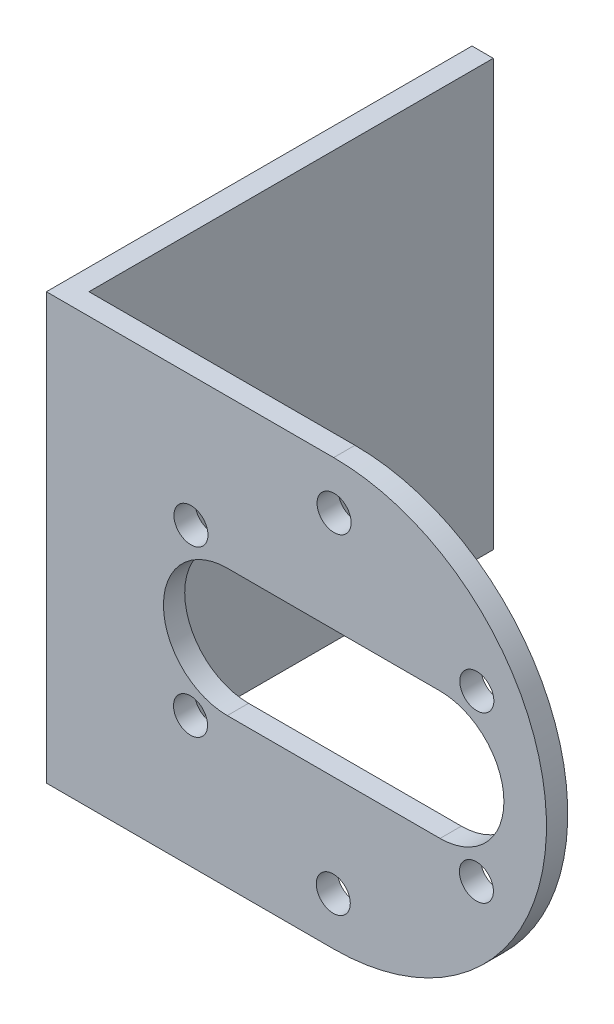
ISO-10303-21;
HEADER;
FILE_DESCRIPTION(('STEP AP214'),'2;1');
FILE_NAME('part.step','',(''),(''),'','','');
FILE_SCHEMA(('AUTOMOTIVE_DESIGN { 1 0 10303 214 1 1 1 1 }'));
ENDSEC;
DATA;
#1=APPLICATION_CONTEXT('core data for automotive mechanical design processes');
#2=APPLICATION_PROTOCOL_DEFINITION('international standard','automotive_design',2000,#1);
#3=PRODUCT_CONTEXT('',#1,'mechanical');
#4=PRODUCT('Part','Part','',(#3));
#5=PRODUCT_RELATED_PRODUCT_CATEGORY('part','',(#4));
#6=PRODUCT_DEFINITION_FORMATION('','',#4);
#7=PRODUCT_DEFINITION_CONTEXT('part definition',#1,'design');
#8=PRODUCT_DEFINITION('design','',#6,#7);
#9=PRODUCT_DEFINITION_SHAPE('','',#8);
#10=(LENGTH_UNIT() NAMED_UNIT(*) SI_UNIT(.MILLI.,.METRE.));
#11=(NAMED_UNIT(*) PLANE_ANGLE_UNIT() SI_UNIT($,.RADIAN.));
#12=(NAMED_UNIT(*) SI_UNIT($,.STERADIAN.) SOLID_ANGLE_UNIT());
#13=UNCERTAINTY_MEASURE_WITH_UNIT(LENGTH_MEASURE(1.E-05),#10,'distance_accuracy_value','');
#14=(GEOMETRIC_REPRESENTATION_CONTEXT(3) GLOBAL_UNCERTAINTY_ASSIGNED_CONTEXT((#13)) GLOBAL_UNIT_ASSIGNED_CONTEXT((#10,
#11,#12)) REPRESENTATION_CONTEXT('',''));
#15=CARTESIAN_POINT('',(0.,0.,0.));
#16=DIRECTION('',(0.,0.,1.));
#17=DIRECTION('',(1.,0.,0.));
#18=AXIS2_PLACEMENT_3D('',#15,#16,#17);
#19=CARTESIAN_POINT('',(2.,0.,0.));
#20=DIRECTION('',(-1.,0.,0.));
#21=DIRECTION('',(0.,0.,1.));
#22=AXIS2_PLACEMENT_3D('',#19,#20,#21);
#23=PLANE('',#22);
#24=DIRECTION('',(0.,1.,0.));
#25=VECTOR('',#24,1.);
#26=CARTESIAN_POINT('',(2.,0.,18.0000000000001));
#27=LINE('',#26,#25);
#28=CARTESIAN_POINT('',(2.,-20.,18.0000000000001));
#29=VERTEX_POINT('',#28);
#30=CARTESIAN_POINT('',(2.,20.,18.0000000000001));
#31=VERTEX_POINT('',#30);
#32=EDGE_CURVE('E225',#29,#31,#27,.T.);
#33=ORIENTED_EDGE('',*,*,#32,.F.);
#34=DIRECTION('',(0.,0.,-1.));
#35=VECTOR('',#34,1.);
#36=CARTESIAN_POINT('',(2.,-20.,-20.));
#37=LINE('',#36,#35);
#38=CARTESIAN_POINT('',(2.,-20.,-20.));
#39=VERTEX_POINT('',#38);
#40=EDGE_CURVE('E231',#29,#39,#37,.T.);
#41=ORIENTED_EDGE('',*,*,#40,.T.);
#42=DIRECTION('',(0.,1.,0.));
#43=VECTOR('',#42,1.);
#44=CARTESIAN_POINT('',(2.,20.,-19.9999999999999));
#45=LINE('',#44,#43);
#46=CARTESIAN_POINT('',(2.,20.,-19.9999999999999));
#47=VERTEX_POINT('',#46);
#48=EDGE_CURVE('E233',#39,#47,#45,.T.);
#49=ORIENTED_EDGE('',*,*,#48,.T.);
#50=DIRECTION('',(0.,0.,1.));
#51=VECTOR('',#50,1.);
#52=CARTESIAN_POINT('',(2.,20.,-19.9999999999999));
#53=LINE('',#52,#51);
#54=EDGE_CURVE('E236',#47,#31,#53,.T.);
#55=ORIENTED_EDGE('',*,*,#54,.T.);
#56=EDGE_LOOP('',(#33,#41,#49,#55));
#57=FACE_BOUND('',#56,.T.);
#58=ADVANCED_FACE('F43',(#57),#23,.F.);
#59=CARTESIAN_POINT('',(2.,20.,20.0000000000001));
#60=DIRECTION('',(0.,0.,-1.));
#61=DIRECTION('',(-1.,0.,0.));
#62=AXIS2_PLACEMENT_3D('',#59,#60,#61);
#63=PLANE('',#62);
#64=DIRECTION('',(-1.,0.,0.));
#65=VECTOR('',#64,1.);
#66=CARTESIAN_POINT('',(37.,5.99999999999994,20.0000000000001));
#67=LINE('',#66,#65);
#68=CARTESIAN_POINT('',(37.,5.99999999999994,20.0000000000001));
#69=VERTEX_POINT('',#68);
#70=CARTESIAN_POINT('',(17.,5.99999999999994,20.0000000000001));
#71=VERTEX_POINT('',#70);
#72=EDGE_CURVE('E132',#69,#71,#67,.T.);
#73=ORIENTED_EDGE('',*,*,#72,.F.);
#74=CARTESIAN_POINT('',(37.,0.,20.0000000000001));
#75=DIRECTION('',(0.,0.,1.));
#76=DIRECTION('',(1.,0.,0.));
#77=AXIS2_PLACEMENT_3D('',#74,#75,#76);
#78=CIRCLE('',#77,6.);
#79=CARTESIAN_POINT('',(37.,-6.00000000000006,20.0000000000001));
#80=VERTEX_POINT('',#79);
#81=EDGE_CURVE('E58',#80,#69,#78,.T.);
#82=ORIENTED_EDGE('',*,*,#81,.F.);
#83=DIRECTION('',(-1.,0.,0.));
#84=VECTOR('',#83,1.);
#85=CARTESIAN_POINT('',(37.,-6.00000000000006,20.0000000000001));
#86=LINE('',#85,#84);
#87=CARTESIAN_POINT('',(17.,-6.00000000000006,20.0000000000001));
#88=VERTEX_POINT('',#87);
#89=EDGE_CURVE('E138',#80,#88,#86,.T.);
#90=ORIENTED_EDGE('',*,*,#89,.T.);
#91=CARTESIAN_POINT('',(17.,0.,20.0000000000001));
#92=DIRECTION('',(0.,0.,1.));
#93=DIRECTION('',(1.,0.,0.));
#94=AXIS2_PLACEMENT_3D('',#91,#92,#93);
#95=CIRCLE('',#94,6.);
#96=EDGE_CURVE('E123',#71,#88,#95,.T.);
#97=ORIENTED_EDGE('',*,*,#96,.F.);
#98=EDGE_LOOP('',(#73,#82,#90,#97));
#99=FACE_BOUND('',#98,.T.);
#100=CARTESIAN_POINT('',(40.4536391388718,7.72278329006898,20.0000000000001));
#101=DIRECTION('',(0.,0.,1.));
#102=DIRECTION('',(-0.965925826289071,0.25881904510251,0.));
#103=AXIS2_PLACEMENT_3D('',#100,#101,#102);
#104=ELLIPSE('',#103,1.6,1.6);
#105=CARTESIAN_POINT('',(38.9081578168092,8.136893762233,20.0000000000001));
#106=VERTEX_POINT('',#105);
#107=EDGE_CURVE('E145',#106,#106,#104,.T.);
#108=ORIENTED_EDGE('',*,*,#107,.F.);
#109=EDGE_LOOP('',(#108));
#110=FACE_BOUND('',#109,.T.);
#111=CARTESIAN_POINT('',(40.4149460865576,-7.78980162257708,20.0000000000001));
#112=DIRECTION('',(0.,0.,1.));
#113=DIRECTION('',(-0.258819045102529,0.965925826289066,0.));
#114=AXIS2_PLACEMENT_3D('',#111,#112,#113);
#115=ELLIPSE('',#114,1.6,1.6);
#116=CARTESIAN_POINT('',(40.0008356143935,-6.24432030051457,20.0000000000001));
#117=VERTEX_POINT('',#116);
#118=EDGE_CURVE('E181',#117,#117,#115,.T.);
#119=ORIENTED_EDGE('',*,*,#118,.F.);
#120=EDGE_LOOP('',(#119));
#121=FACE_BOUND('',#120,.T.);
#122=CARTESIAN_POINT('',(26.9613069476856,-15.512584912646,20.0000000000001));
#123=DIRECTION('',(0.,0.,1.));
#124=DIRECTION('',(0.707106781186548,0.707106781186547,0.));
#125=AXIS2_PLACEMENT_3D('',#122,#123,#124);
#126=ELLIPSE('',#125,1.6,1.6);
#127=CARTESIAN_POINT('',(28.0926777975841,-14.3812140627475,20.0000000000001));
#128=VERTEX_POINT('',#127);
#129=EDGE_CURVE('E175',#128,#128,#126,.T.);
#130=ORIENTED_EDGE('',*,*,#129,.F.);
#131=EDGE_LOOP('',(#130));
#132=FACE_BOUND('',#131,.T.);
#133=CARTESIAN_POINT('',(13.5463608611282,-7.72278329006889,20.0000000000001));
#134=DIRECTION('',(0.,0.,1.));
#135=DIRECTION('',(0.96592582628907,-0.258819045102517,0.));
#136=AXIS2_PLACEMENT_3D('',#133,#134,#135);
#137=ELLIPSE('',#136,1.6,1.6);
#138=CARTESIAN_POINT('',(15.0918421831907,-8.13689376223292,20.0000000000001));
#139=VERTEX_POINT('',#138);
#140=EDGE_CURVE('E153',#139,#139,#137,.T.);
#141=ORIENTED_EDGE('',*,*,#140,.F.);
#142=EDGE_LOOP('',(#141));
#143=FACE_BOUND('',#142,.T.);
#144=CARTESIAN_POINT('',(13.5850539134425,7.78980162257717,20.0000000000001));
#145=DIRECTION('',(0.,0.,1.));
#146=DIRECTION('',(0.258819045102522,-0.965925826289068,0.));
#147=AXIS2_PLACEMENT_3D('',#144,#145,#146);
#148=ELLIPSE('',#147,1.6,1.6);
#149=CARTESIAN_POINT('',(13.9991643856065,6.24432030051466,20.0000000000001));
#150=VERTEX_POINT('',#149);
#151=EDGE_CURVE('E152',#150,#150,#148,.T.);
#152=ORIENTED_EDGE('',*,*,#151,.F.);
#153=EDGE_LOOP('',(#152));
#154=FACE_BOUND('',#153,.T.);
#155=CARTESIAN_POINT('',(27.0386930523144,15.512584912646,20.0000000000001));
#156=DIRECTION('',(0.,0.,1.));
#157=DIRECTION('',(-0.707106781186548,-0.707106781186547,0.));
#158=AXIS2_PLACEMENT_3D('',#155,#156,#157);
#159=ELLIPSE('',#158,1.6,1.6);
#160=CARTESIAN_POINT('',(25.9073222024159,14.3812140627475,20.0000000000001));
#161=VERTEX_POINT('',#160);
#162=EDGE_CURVE('E203',#161,#161,#159,.T.);
#163=ORIENTED_EDGE('',*,*,#162,.F.);
#164=EDGE_LOOP('',(#163));
#165=FACE_BOUND('',#164,.T.);
#166=DIRECTION('',(0.,-1.,0.));
#167=VECTOR('',#166,1.);
#168=CARTESIAN_POINT('',(0.,20.,20.0000000000001));
#169=LINE('',#168,#167);
#170=CARTESIAN_POINT('',(0.,20.,20.0000000000001));
#171=VERTEX_POINT('',#170);
#172=CARTESIAN_POINT('',(0.,-20.,20.0000000000001));
#173=VERTEX_POINT('',#172);
#174=EDGE_CURVE('E230',#171,#173,#169,.T.);
#175=ORIENTED_EDGE('',*,*,#174,.T.);
#176=DIRECTION('',(-1.,0.,0.));
#177=VECTOR('',#176,1.);
#178=CARTESIAN_POINT('',(2.,-20.,20.0000000000001));
#179=LINE('',#178,#177);
#180=CARTESIAN_POINT('',(27.,-20.,20.0000000000001));
#181=VERTEX_POINT('',#180);
#182=EDGE_CURVE('E254',#181,#173,#179,.T.);
#183=ORIENTED_EDGE('',*,*,#182,.F.);
#184=CARTESIAN_POINT('',(27.,0.,20.0000000000001));
#185=DIRECTION('',(0.,0.,1.));
#186=DIRECTION('',(1.,0.,0.));
#187=AXIS2_PLACEMENT_3D('',#184,#185,#186);
#188=CIRCLE('',#187,20.);
#189=CARTESIAN_POINT('',(27.,20.,20.0000000000001));
#190=VERTEX_POINT('',#189);
#191=EDGE_CURVE('E209',#181,#190,#188,.T.);
#192=ORIENTED_EDGE('',*,*,#191,.T.);
#193=DIRECTION('',(-1.,0.,0.));
#194=VECTOR('',#193,1.);
#195=CARTESIAN_POINT('',(2.,20.,20.0000000000001));
#196=LINE('',#195,#194);
#197=EDGE_CURVE('E238',#190,#171,#196,.T.);
#198=ORIENTED_EDGE('',*,*,#197,.T.);
#199=EDGE_LOOP('',(#175,#183,#192,#198));
#200=FACE_BOUND('',#199,.T.);
#201=ADVANCED_FACE('F45',(#99,#110,#121,#132,#143,#154,#165,#200),#63,.F.);
#202=CARTESIAN_POINT('',(2.,-20.,-20.));
#203=DIRECTION('',(0.,1.,0.));
#204=DIRECTION('',(0.,0.,1.));
#205=AXIS2_PLACEMENT_3D('',#202,#203,#204);
#206=PLANE('',#205);
#207=DIRECTION('',(0.,0.,-1.));
#208=VECTOR('',#207,1.);
#209=CARTESIAN_POINT('',(0.,-20.,-20.));
#210=LINE('',#209,#208);
#211=CARTESIAN_POINT('',(0.,-20.,-20.));
#212=VERTEX_POINT('',#211);
#213=EDGE_CURVE('E241',#173,#212,#210,.T.);
#214=ORIENTED_EDGE('',*,*,#213,.T.);
#215=DIRECTION('',(-1.,0.,0.));
#216=VECTOR('',#215,1.);
#217=CARTESIAN_POINT('',(2.,-20.,-20.));
#218=LINE('',#217,#216);
#219=EDGE_CURVE('E251',#39,#212,#218,.T.);
#220=ORIENTED_EDGE('',*,*,#219,.F.);
#221=ORIENTED_EDGE('',*,*,#40,.F.);
#222=DIRECTION('',(1.,0.,0.));
#223=VECTOR('',#222,1.);
#224=CARTESIAN_POINT('',(0.,-20.,18.0000000000001));
#225=LINE('',#224,#223);
#226=CARTESIAN_POINT('',(27.,-20.,18.0000000000001));
#227=VERTEX_POINT('',#226);
#228=EDGE_CURVE('E212',#29,#227,#225,.T.);
#229=ORIENTED_EDGE('',*,*,#228,.T.);
#230=DIRECTION('',(0.,0.,1.));
#231=VECTOR('',#230,1.);
#232=CARTESIAN_POINT('',(27.,-20.,18.0000000000001));
#233=LINE('',#232,#231);
#234=EDGE_CURVE('E219',#227,#181,#233,.T.);
#235=ORIENTED_EDGE('',*,*,#234,.T.);
#236=ORIENTED_EDGE('',*,*,#182,.T.);
#237=EDGE_LOOP('',(#214,#220,#221,#229,#235,#236));
#238=FACE_BOUND('',#237,.T.);
#239=ADVANCED_FACE('F280',(#238),#206,.F.);
#240=CARTESIAN_POINT('',(2.,20.,-19.9999999999999));
#241=DIRECTION('',(0.,0.,1.));
#242=DIRECTION('',(0.,-1.,0.));
#243=AXIS2_PLACEMENT_3D('',#240,#241,#242);
#244=PLANE('',#243);
#245=DIRECTION('',(0.,1.,0.));
#246=VECTOR('',#245,1.);
#247=CARTESIAN_POINT('',(0.,20.,-19.9999999999999));
#248=LINE('',#247,#246);
#249=CARTESIAN_POINT('',(0.,20.,-19.9999999999999));
#250=VERTEX_POINT('',#249);
#251=EDGE_CURVE('E243',#212,#250,#248,.T.);
#252=ORIENTED_EDGE('',*,*,#251,.T.);
#253=DIRECTION('',(-1.,0.,0.));
#254=VECTOR('',#253,1.);
#255=CARTESIAN_POINT('',(2.,20.,-19.9999999999999));
#256=LINE('',#255,#254);
#257=EDGE_CURVE('E248',#47,#250,#256,.T.);
#258=ORIENTED_EDGE('',*,*,#257,.F.);
#259=ORIENTED_EDGE('',*,*,#48,.F.);
#260=ORIENTED_EDGE('',*,*,#219,.T.);
#261=EDGE_LOOP('',(#252,#258,#259,#260));
#262=FACE_BOUND('',#261,.T.);
#263=ADVANCED_FACE('F291',(#262),#244,.F.);
#264=CARTESIAN_POINT('',(2.,20.,-19.9999999999999));
#265=DIRECTION('',(0.,-1.,0.));
#266=DIRECTION('',(0.,0.,-1.));
#267=AXIS2_PLACEMENT_3D('',#264,#265,#266);
#268=PLANE('',#267);
#269=ORIENTED_EDGE('',*,*,#197,.F.);
#270=DIRECTION('',(0.,0.,1.));
#271=VECTOR('',#270,1.);
#272=CARTESIAN_POINT('',(27.,20.,18.0000000000001));
#273=LINE('',#272,#271);
#274=CARTESIAN_POINT('',(27.,20.,18.0000000000001));
#275=VERTEX_POINT('',#274);
#276=EDGE_CURVE('E222',#275,#190,#273,.T.);
#277=ORIENTED_EDGE('',*,*,#276,.F.);
#278=DIRECTION('',(1.,0.,0.));
#279=VECTOR('',#278,1.);
#280=CARTESIAN_POINT('',(0.,20.,18.0000000000001));
#281=LINE('',#280,#279);
#282=EDGE_CURVE('E217',#31,#275,#281,.T.);
#283=ORIENTED_EDGE('',*,*,#282,.F.);
#284=ORIENTED_EDGE('',*,*,#54,.F.);
#285=ORIENTED_EDGE('',*,*,#257,.T.);
#286=DIRECTION('',(0.,0.,1.));
#287=VECTOR('',#286,1.);
#288=CARTESIAN_POINT('',(0.,20.,-19.9999999999999));
#289=LINE('',#288,#287);
#290=EDGE_CURVE('E234',#250,#171,#289,.T.);
#291=ORIENTED_EDGE('',*,*,#290,.T.);
#292=EDGE_LOOP('',(#269,#277,#283,#284,#285,#291));
#293=FACE_BOUND('',#292,.T.);
#294=ADVANCED_FACE('F287',(#293),#268,.F.);
#295=CARTESIAN_POINT('',(0.,0.,0.));
#296=DIRECTION('',(-1.,0.,0.));
#297=DIRECTION('',(0.,0.,1.));
#298=AXIS2_PLACEMENT_3D('',#295,#296,#297);
#299=PLANE('',#298);
#300=ORIENTED_EDGE('',*,*,#174,.F.);
#301=ORIENTED_EDGE('',*,*,#290,.F.);
#302=ORIENTED_EDGE('',*,*,#251,.F.);
#303=ORIENTED_EDGE('',*,*,#213,.F.);
#304=EDGE_LOOP('',(#300,#301,#302,#303));
#305=FACE_BOUND('',#304,.T.);
#306=ADVANCED_FACE('F284',(#305),#299,.T.);
#307=CARTESIAN_POINT('',(27.,0.,18.0000000000001));
#308=DIRECTION('',(0.,0.,1.));
#309=DIRECTION('',(1.,0.,0.));
#310=AXIS2_PLACEMENT_3D('',#307,#308,#309);
#311=PLANE('',#310);
#312=DIRECTION('',(-1.,0.,0.));
#313=VECTOR('',#312,1.);
#314=CARTESIAN_POINT('',(27.,-6.00000000000006,18.0000000000001));
#315=LINE('',#314,#313);
#316=CARTESIAN_POINT('',(37.,-6.00000000000006,18.0000000000001));
#317=VERTEX_POINT('',#316);
#318=CARTESIAN_POINT('',(17.,-6.00000000000006,18.0000000000001));
#319=VERTEX_POINT('',#318);
#320=EDGE_CURVE('E51',#317,#319,#315,.T.);
#321=ORIENTED_EDGE('',*,*,#320,.F.);
#322=CARTESIAN_POINT('',(37.,0.,18.0000000000001));
#323=DIRECTION('',(0.,0.,1.));
#324=DIRECTION('',(1.,0.,0.));
#325=AXIS2_PLACEMENT_3D('',#322,#323,#324);
#326=CIRCLE('',#325,6.);
#327=CARTESIAN_POINT('',(37.,5.99999999999994,18.0000000000001));
#328=VERTEX_POINT('',#327);
#329=EDGE_CURVE('E11',#317,#328,#326,.T.);
#330=ORIENTED_EDGE('',*,*,#329,.T.);
#331=DIRECTION('',(-1.,0.,0.));
#332=VECTOR('',#331,1.);
#333=CARTESIAN_POINT('',(27.,5.99999999999994,18.0000000000001));
#334=LINE('',#333,#332);
#335=CARTESIAN_POINT('',(17.,5.99999999999994,18.0000000000001));
#336=VERTEX_POINT('',#335);
#337=EDGE_CURVE('E257',#328,#336,#334,.T.);
#338=ORIENTED_EDGE('',*,*,#337,.T.);
#339=CARTESIAN_POINT('',(17.,0.,18.0000000000001));
#340=DIRECTION('',(0.,0.,1.));
#341=DIRECTION('',(1.,0.,0.));
#342=AXIS2_PLACEMENT_3D('',#339,#340,#341);
#343=CIRCLE('',#342,6.);
#344=EDGE_CURVE('E126',#336,#319,#343,.T.);
#345=ORIENTED_EDGE('',*,*,#344,.T.);
#346=EDGE_LOOP('',(#321,#330,#338,#345));
#347=FACE_BOUND('',#346,.T.);
#348=CARTESIAN_POINT('',(40.4536391388718,7.72278329006898,18.0000000000001));
#349=DIRECTION('',(0.,0.,1.));
#350=DIRECTION('',(-0.965925826289071,0.25881904510251,0.));
#351=AXIS2_PLACEMENT_3D('',#348,#349,#350);
#352=ELLIPSE('',#351,1.6,1.6);
#353=CARTESIAN_POINT('',(38.9081578168092,8.136893762233,18.0000000000001));
#354=VERTEX_POINT('',#353);
#355=EDGE_CURVE('E184',#354,#354,#352,.T.);
#356=ORIENTED_EDGE('',*,*,#355,.T.);
#357=EDGE_LOOP('',(#356));
#358=FACE_BOUND('',#357,.T.);
#359=CARTESIAN_POINT('',(40.4149460865576,-7.78980162257708,18.0000000000001));
#360=DIRECTION('',(0.,0.,1.));
#361=DIRECTION('',(-0.258819045102529,0.965925826289066,0.));
#362=AXIS2_PLACEMENT_3D('',#359,#360,#361);
#363=ELLIPSE('',#362,1.6,1.6);
#364=CARTESIAN_POINT('',(40.0008356143935,-6.24432030051457,18.0000000000001));
#365=VERTEX_POINT('',#364);
#366=EDGE_CURVE('E177',#365,#365,#363,.T.);
#367=ORIENTED_EDGE('',*,*,#366,.T.);
#368=EDGE_LOOP('',(#367));
#369=FACE_BOUND('',#368,.T.);
#370=CARTESIAN_POINT('',(26.9613069476856,-15.512584912646,18.0000000000001));
#371=DIRECTION('',(0.,0.,1.));
#372=DIRECTION('',(0.707106781186548,0.707106781186547,0.));
#373=AXIS2_PLACEMENT_3D('',#370,#371,#372);
#374=ELLIPSE('',#373,1.6,1.6);
#375=CARTESIAN_POINT('',(28.0926777975841,-14.3812140627475,18.0000000000001));
#376=VERTEX_POINT('',#375);
#377=EDGE_CURVE('E171',#376,#376,#374,.T.);
#378=ORIENTED_EDGE('',*,*,#377,.T.);
#379=EDGE_LOOP('',(#378));
#380=FACE_BOUND('',#379,.T.);
#381=CARTESIAN_POINT('',(13.5463608611282,-7.72278329006889,18.0000000000001));
#382=DIRECTION('',(0.,0.,1.));
#383=DIRECTION('',(0.96592582628907,-0.258819045102517,0.));
#384=AXIS2_PLACEMENT_3D('',#381,#382,#383);
#385=ELLIPSE('',#384,1.6,1.6);
#386=CARTESIAN_POINT('',(15.0918421831907,-8.13689376223292,18.0000000000001));
#387=VERTEX_POINT('',#386);
#388=EDGE_CURVE('E148',#387,#387,#385,.T.);
#389=ORIENTED_EDGE('',*,*,#388,.T.);
#390=EDGE_LOOP('',(#389));
#391=FACE_BOUND('',#390,.T.);
#392=CARTESIAN_POINT('',(13.5850539134425,7.78980162257717,18.0000000000001));
#393=DIRECTION('',(0.,0.,1.));
#394=DIRECTION('',(0.258819045102522,-0.965925826289068,0.));
#395=AXIS2_PLACEMENT_3D('',#392,#393,#394);
#396=ELLIPSE('',#395,1.6,1.6);
#397=CARTESIAN_POINT('',(13.9991643856065,6.24432030051466,18.0000000000001));
#398=VERTEX_POINT('',#397);
#399=EDGE_CURVE('E199',#398,#398,#396,.T.);
#400=ORIENTED_EDGE('',*,*,#399,.T.);
#401=EDGE_LOOP('',(#400));
#402=FACE_BOUND('',#401,.T.);
#403=CARTESIAN_POINT('',(27.0386930523144,15.512584912646,18.0000000000001));
#404=DIRECTION('',(0.,0.,1.));
#405=DIRECTION('',(-0.707106781186548,-0.707106781186547,0.));
#406=AXIS2_PLACEMENT_3D('',#403,#404,#405);
#407=ELLIPSE('',#406,1.6,1.6);
#408=CARTESIAN_POINT('',(25.9073222024159,14.3812140627475,18.0000000000001));
#409=VERTEX_POINT('',#408);
#410=EDGE_CURVE('E205',#409,#409,#407,.T.);
#411=ORIENTED_EDGE('',*,*,#410,.T.);
#412=EDGE_LOOP('',(#411));
#413=FACE_BOUND('',#412,.T.);
#414=ORIENTED_EDGE('',*,*,#228,.F.);
#415=ORIENTED_EDGE('',*,*,#32,.T.);
#416=ORIENTED_EDGE('',*,*,#282,.T.);
#417=CARTESIAN_POINT('',(27.,0.,18.0000000000001));
#418=DIRECTION('',(0.,0.,1.));
#419=DIRECTION('',(1.,0.,0.));
#420=AXIS2_PLACEMENT_3D('',#417,#418,#419);
#421=CIRCLE('',#420,20.);
#422=EDGE_CURVE('E214',#227,#275,#421,.T.);
#423=ORIENTED_EDGE('',*,*,#422,.F.);
#424=EDGE_LOOP('',(#414,#415,#416,#423));
#425=FACE_BOUND('',#424,.T.);
#426=ADVANCED_FACE('F264',(#347,#358,#369,#380,#391,#402,#413,#425),#311,.F.);
#427=CARTESIAN_POINT('',(27.,0.,18.0000000000001));
#428=DIRECTION('',(0.,0.,1.));
#429=DIRECTION('',(1.,0.,0.));
#430=AXIS2_PLACEMENT_3D('',#427,#428,#429);
#431=CYLINDRICAL_SURFACE('',#430,20.);
#432=ORIENTED_EDGE('',*,*,#191,.F.);
#433=ORIENTED_EDGE('',*,*,#234,.F.);
#434=ORIENTED_EDGE('',*,*,#422,.T.);
#435=ORIENTED_EDGE('',*,*,#276,.T.);
#436=EDGE_LOOP('',(#432,#433,#434,#435));
#437=FACE_BOUND('',#436,.T.);
#438=ADVANCED_FACE('F283',(#437),#431,.T.);
#439=DIRECTION('',(0.,0.,1.));
#440=VECTOR('',#439,1.);
#441=SURFACE_OF_LINEAR_EXTRUSION('',#407,#440);
#442=ORIENTED_EDGE('',*,*,#410,.F.);
#443=EDGE_LOOP('',(#442));
#444=FACE_BOUND('',#443,.T.);
#445=ORIENTED_EDGE('',*,*,#162,.T.);
#446=EDGE_LOOP('',(#445));
#447=FACE_BOUND('',#446,.T.);
#448=ADVANCED_FACE('F195',(#444,#447),#441,.F.);
#449=DIRECTION('',(0.,0.,1.));
#450=VECTOR('',#449,1.);
#451=SURFACE_OF_LINEAR_EXTRUSION('',#396,#450);
#452=ORIENTED_EDGE('',*,*,#399,.F.);
#453=EDGE_LOOP('',(#452));
#454=FACE_BOUND('',#453,.T.);
#455=ORIENTED_EDGE('',*,*,#151,.T.);
#456=EDGE_LOOP('',(#455));
#457=FACE_BOUND('',#456,.T.);
#458=ADVANCED_FACE('F161',(#454,#457),#451,.F.);
#459=DIRECTION('',(0.,0.,1.));
#460=VECTOR('',#459,1.);
#461=SURFACE_OF_LINEAR_EXTRUSION('',#385,#460);
#462=ORIENTED_EDGE('',*,*,#388,.F.);
#463=EDGE_LOOP('',(#462));
#464=FACE_BOUND('',#463,.T.);
#465=ORIENTED_EDGE('',*,*,#140,.T.);
#466=EDGE_LOOP('',(#465));
#467=FACE_BOUND('',#466,.T.);
#468=ADVANCED_FACE('F156',(#464,#467),#461,.F.);
#469=DIRECTION('',(0.,0.,1.));
#470=VECTOR('',#469,1.);
#471=SURFACE_OF_LINEAR_EXTRUSION('',#374,#470);
#472=ORIENTED_EDGE('',*,*,#377,.F.);
#473=EDGE_LOOP('',(#472));
#474=FACE_BOUND('',#473,.T.);
#475=ORIENTED_EDGE('',*,*,#129,.T.);
#476=EDGE_LOOP('',(#475));
#477=FACE_BOUND('',#476,.T.);
#478=ADVANCED_FACE('F160',(#474,#477),#471,.F.);
#479=DIRECTION('',(0.,0.,1.));
#480=VECTOR('',#479,1.);
#481=SURFACE_OF_LINEAR_EXTRUSION('',#363,#480);
#482=ORIENTED_EDGE('',*,*,#366,.F.);
#483=EDGE_LOOP('',(#482));
#484=FACE_BOUND('',#483,.T.);
#485=ORIENTED_EDGE('',*,*,#118,.T.);
#486=EDGE_LOOP('',(#485));
#487=FACE_BOUND('',#486,.T.);
#488=ADVANCED_FACE('F167',(#484,#487),#481,.F.);
#489=DIRECTION('',(0.,0.,1.));
#490=VECTOR('',#489,1.);
#491=SURFACE_OF_LINEAR_EXTRUSION('',#352,#490);
#492=ORIENTED_EDGE('',*,*,#355,.F.);
#493=EDGE_LOOP('',(#492));
#494=FACE_BOUND('',#493,.T.);
#495=ORIENTED_EDGE('',*,*,#107,.T.);
#496=EDGE_LOOP('',(#495));
#497=FACE_BOUND('',#496,.T.);
#498=ADVANCED_FACE('F189',(#494,#497),#491,.F.);
#499=CARTESIAN_POINT('',(37.,0.,-20.));
#500=DIRECTION('',(0.,0.,1.));
#501=DIRECTION('',(1.,0.,0.));
#502=AXIS2_PLACEMENT_3D('',#499,#500,#501);
#503=CYLINDRICAL_SURFACE('',#502,6.);
#504=DIRECTION('',(0.,0.,1.));
#505=VECTOR('',#504,1.);
#506=CARTESIAN_POINT('',(37.,-6.00000000000006,-20.));
#507=LINE('',#506,#505);
#508=EDGE_CURVE('E143',#317,#80,#507,.T.);
#509=ORIENTED_EDGE('',*,*,#508,.T.);
#510=ORIENTED_EDGE('',*,*,#81,.T.);
#511=DIRECTION('',(0.,0.,1.));
#512=VECTOR('',#511,1.);
#513=CARTESIAN_POINT('',(37.,5.99999999999994,-20.));
#514=LINE('',#513,#512);
#515=EDGE_CURVE('E129',#328,#69,#514,.T.);
#516=ORIENTED_EDGE('',*,*,#515,.F.);
#517=ORIENTED_EDGE('',*,*,#329,.F.);
#518=EDGE_LOOP('',(#509,#510,#516,#517));
#519=FACE_BOUND('',#518,.T.);
#520=ADVANCED_FACE('F163',(#519),#503,.F.);
#521=CARTESIAN_POINT('',(37.,-6.00000000000006,-20.));
#522=DIRECTION('',(0.,1.,0.));
#523=DIRECTION('',(0.,0.,1.));
#524=AXIS2_PLACEMENT_3D('',#521,#522,#523);
#525=PLANE('',#524);
#526=ORIENTED_EDGE('',*,*,#320,.T.);
#527=DIRECTION('',(0.,0.,1.));
#528=VECTOR('',#527,1.);
#529=CARTESIAN_POINT('',(17.,-6.00000000000006,-20.));
#530=LINE('',#529,#528);
#531=EDGE_CURVE('E128',#319,#88,#530,.T.);
#532=ORIENTED_EDGE('',*,*,#531,.T.);
#533=ORIENTED_EDGE('',*,*,#89,.F.);
#534=ORIENTED_EDGE('',*,*,#508,.F.);
#535=EDGE_LOOP('',(#526,#532,#533,#534));
#536=FACE_BOUND('',#535,.T.);
#537=ADVANCED_FACE('F262',(#536),#525,.T.);
#538=CARTESIAN_POINT('',(17.,0.,-20.));
#539=DIRECTION('',(0.,0.,1.));
#540=DIRECTION('',(1.,0.,0.));
#541=AXIS2_PLACEMENT_3D('',#538,#539,#540);
#542=CYLINDRICAL_SURFACE('',#541,6.);
#543=DIRECTION('',(0.,0.,1.));
#544=VECTOR('',#543,1.);
#545=CARTESIAN_POINT('',(17.,5.99999999999994,-20.));
#546=LINE('',#545,#544);
#547=EDGE_CURVE('E66',#336,#71,#546,.T.);
#548=ORIENTED_EDGE('',*,*,#547,.T.);
#549=ORIENTED_EDGE('',*,*,#96,.T.);
#550=ORIENTED_EDGE('',*,*,#531,.F.);
#551=ORIENTED_EDGE('',*,*,#344,.F.);
#552=EDGE_LOOP('',(#548,#549,#550,#551));
#553=FACE_BOUND('',#552,.T.);
#554=ADVANCED_FACE('F120',(#553),#542,.F.);
#555=CARTESIAN_POINT('',(37.,5.99999999999994,-20.));
#556=DIRECTION('',(0.,1.,0.));
#557=DIRECTION('',(0.,0.,1.));
#558=AXIS2_PLACEMENT_3D('',#555,#556,#557);
#559=PLANE('',#558);
#560=ORIENTED_EDGE('',*,*,#515,.T.);
#561=ORIENTED_EDGE('',*,*,#72,.T.);
#562=ORIENTED_EDGE('',*,*,#547,.F.);
#563=ORIENTED_EDGE('',*,*,#337,.F.);
#564=EDGE_LOOP('',(#560,#561,#562,#563));
#565=FACE_BOUND('',#564,.T.);
#566=ADVANCED_FACE('F133',(#565),#559,.F.);
#567=CLOSED_SHELL('',(#58,#201,#239,#263,#294,#306,#426,#438,#448,#458,#468,#478,#488,#498,#520,
#537,#554,#566));
#568=MANIFOLD_SOLID_BREP('B2',#567);
#569=ADVANCED_BREP_SHAPE_REPRESENTATION('',(#18,#568),#14);
#570=SHAPE_DEFINITION_REPRESENTATION(#9,#569);
ENDSEC;
END-ISO-10303-21;
